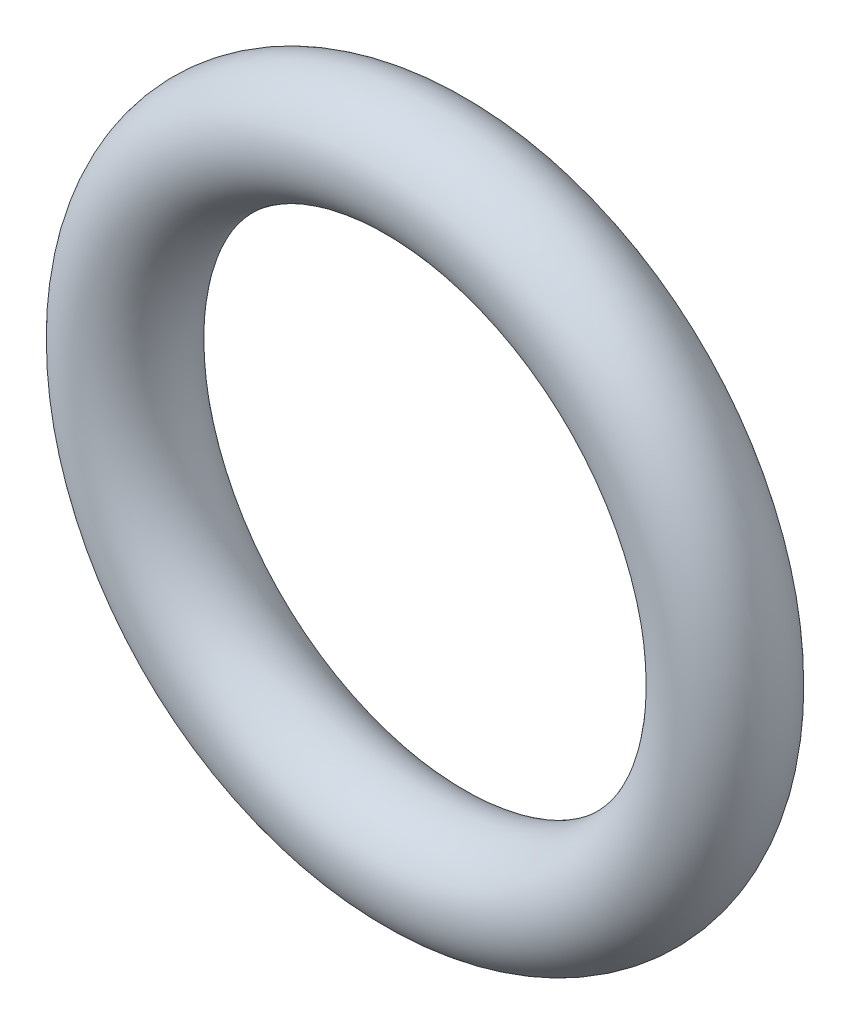
ISO-10303-21;
HEADER;
FILE_DESCRIPTION(('STEP AP214'),'2;1');
FILE_NAME('part.step','',(''),(''),'','','');
FILE_SCHEMA(('AUTOMOTIVE_DESIGN { 1 0 10303 214 1 1 1 1 }'));
ENDSEC;
DATA;
#1=APPLICATION_CONTEXT('core data for automotive mechanical design processes');
#2=APPLICATION_PROTOCOL_DEFINITION('international standard','automotive_design',2000,#1);
#3=PRODUCT_CONTEXT('',#1,'mechanical');
#4=PRODUCT('Part','Part','',(#3));
#5=PRODUCT_RELATED_PRODUCT_CATEGORY('part','',(#4));
#6=PRODUCT_DEFINITION_FORMATION('','',#4);
#7=PRODUCT_DEFINITION_CONTEXT('part definition',#1,'design');
#8=PRODUCT_DEFINITION('design','',#6,#7);
#9=PRODUCT_DEFINITION_SHAPE('','',#8);
#10=(LENGTH_UNIT() NAMED_UNIT(*) SI_UNIT(.MILLI.,.METRE.));
#11=(NAMED_UNIT(*) PLANE_ANGLE_UNIT() SI_UNIT($,.RADIAN.));
#12=(NAMED_UNIT(*) SI_UNIT($,.STERADIAN.) SOLID_ANGLE_UNIT());
#13=UNCERTAINTY_MEASURE_WITH_UNIT(LENGTH_MEASURE(1.E-05),#10,'distance_accuracy_value','');
#14=(GEOMETRIC_REPRESENTATION_CONTEXT(3) GLOBAL_UNCERTAINTY_ASSIGNED_CONTEXT((#13)) GLOBAL_UNIT_ASSIGNED_CONTEXT((#10,
#11,#12)) REPRESENTATION_CONTEXT('',''));
#15=CARTESIAN_POINT('',(0.,0.,0.));
#16=DIRECTION('',(0.,0.,1.));
#17=DIRECTION('',(1.,0.,0.));
#18=AXIS2_PLACEMENT_3D('',#15,#16,#17);
#19=CARTESIAN_POINT('',(0.,0.,0.));
#20=DIRECTION('',(0.,0.,1.));
#21=DIRECTION('',(1.,0.,0.));
#22=AXIS2_PLACEMENT_3D('',#19,#20,#21);
#23=TOROIDAL_SURFACE('',#22,9.4996,1.76530000000001);
#24=CARTESIAN_POINT('',(11.2649,0.,0.));
#25=VERTEX_POINT('',#24);
#26=VERTEX_LOOP('',#25);
#27=FACE_BOUND('',#26,.T.);
#28=ADVANCED_FACE('F32',(#27),#23,.T.);
#29=CLOSED_SHELL('',(#28));
#30=MANIFOLD_SOLID_BREP('B2',#29);
#31=ADVANCED_BREP_SHAPE_REPRESENTATION('',(#18,#30),#14);
#32=SHAPE_DEFINITION_REPRESENTATION(#9,#31);
ENDSEC;
END-ISO-10303-21;
